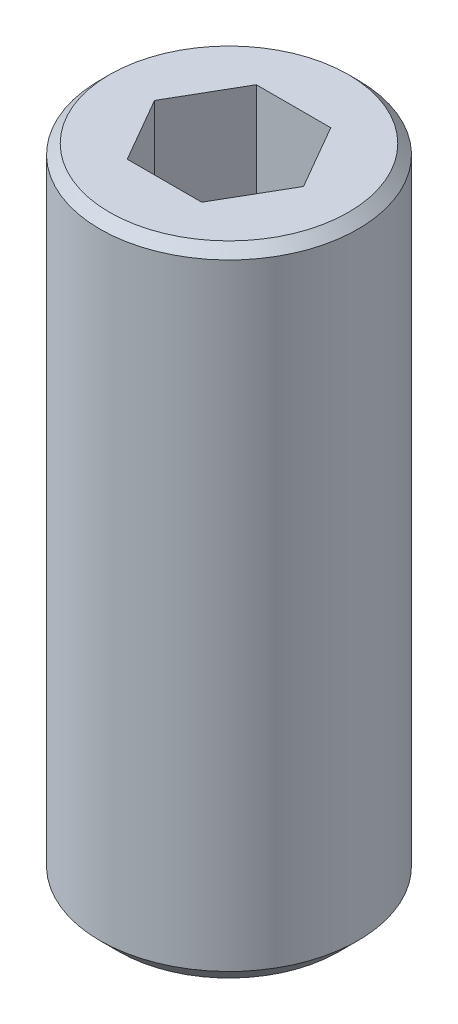
ISO-10303-21;
HEADER;
FILE_DESCRIPTION(('STEP AP214'),'2;1');
FILE_NAME('part.step','',(''),(''),'','','');
FILE_SCHEMA(('AUTOMOTIVE_DESIGN { 1 0 10303 214 1 1 1 1 }'));
ENDSEC;
DATA;
#1=APPLICATION_CONTEXT('core data for automotive mechanical design processes');
#2=APPLICATION_PROTOCOL_DEFINITION('international standard','automotive_design',2000,#1);
#3=PRODUCT_CONTEXT('',#1,'mechanical');
#4=PRODUCT('Part','Part','',(#3));
#5=PRODUCT_RELATED_PRODUCT_CATEGORY('part','',(#4));
#6=PRODUCT_DEFINITION_FORMATION('','',#4);
#7=PRODUCT_DEFINITION_CONTEXT('part definition',#1,'design');
#8=PRODUCT_DEFINITION('design','',#6,#7);
#9=PRODUCT_DEFINITION_SHAPE('','',#8);
#10=(LENGTH_UNIT() NAMED_UNIT(*) SI_UNIT(.MILLI.,.METRE.));
#11=(NAMED_UNIT(*) PLANE_ANGLE_UNIT() SI_UNIT($,.RADIAN.));
#12=(NAMED_UNIT(*) SI_UNIT($,.STERADIAN.) SOLID_ANGLE_UNIT());
#13=UNCERTAINTY_MEASURE_WITH_UNIT(LENGTH_MEASURE(1.E-05),#10,'distance_accuracy_value','');
#14=(GEOMETRIC_REPRESENTATION_CONTEXT(3) GLOBAL_UNCERTAINTY_ASSIGNED_CONTEXT((#13)) GLOBAL_UNIT_ASSIGNED_CONTEXT((#10,
#11,#12)) REPRESENTATION_CONTEXT('',''));
#15=CARTESIAN_POINT('',(0.,0.,0.));
#16=DIRECTION('',(0.,0.,1.));
#17=DIRECTION('',(1.,0.,0.));
#18=AXIS2_PLACEMENT_3D('',#15,#16,#17);
#19=CARTESIAN_POINT('',(0.,0.,0.));
#20=DIRECTION('',(0.,-1.,0.));
#21=DIRECTION('',(0.,0.,-1.));
#22=AXIS2_PLACEMENT_3D('',#19,#20,#21);
#23=PLANE('',#22);
#24=CARTESIAN_POINT('',(0.,0.,0.));
#25=DIRECTION('',(0.,-1.,0.));
#26=DIRECTION('',(0.,0.,-1.));
#27=AXIS2_PLACEMENT_3D('',#24,#25,#26);
#28=CIRCLE('',#27,1.85);
#29=CARTESIAN_POINT('',(0.,0.,-1.85));
#30=VERTEX_POINT('',#29);
#31=EDGE_CURVE('E44',#30,#30,#28,.F.);
#32=ORIENTED_EDGE('',*,*,#31,.T.);
#33=EDGE_LOOP('',(#32));
#34=FACE_BOUND('',#33,.T.);
#35=DIRECTION('',(-0.5,0.,0.866025403784439));
#36=VECTOR('',#35,1.);
#37=CARTESIAN_POINT('',(-0.577350269189626,0.,-1.));
#38=LINE('',#37,#36);
#39=CARTESIAN_POINT('',(-0.577350269189626,0.,-1.));
#40=VERTEX_POINT('',#39);
#41=CARTESIAN_POINT('',(-1.15470053837925,0.,0.));
#42=VERTEX_POINT('',#41);
#43=EDGE_CURVE('E125',#40,#42,#38,.T.);
#44=ORIENTED_EDGE('',*,*,#43,.F.);
#45=DIRECTION('',(-1.,0.,0.));
#46=VECTOR('',#45,1.);
#47=CARTESIAN_POINT('',(0.577350269189626,0.,-1.));
#48=LINE('',#47,#46);
#49=CARTESIAN_POINT('',(0.577350269189626,0.,-1.));
#50=VERTEX_POINT('',#49);
#51=EDGE_CURVE('E51',#50,#40,#48,.T.);
#52=ORIENTED_EDGE('',*,*,#51,.F.);
#53=DIRECTION('',(-0.5,0.,-0.866025403784438));
#54=VECTOR('',#53,1.);
#55=CARTESIAN_POINT('',(1.15470053837925,0.,0.));
#56=LINE('',#55,#54);
#57=CARTESIAN_POINT('',(1.15470053837925,0.,0.));
#58=VERTEX_POINT('',#57);
#59=EDGE_CURVE('E134',#58,#50,#56,.T.);
#60=ORIENTED_EDGE('',*,*,#59,.F.);
#61=DIRECTION('',(0.5,0.,-0.866025403784439));
#62=VECTOR('',#61,1.);
#63=CARTESIAN_POINT('',(0.577350269189626,0.,1.));
#64=LINE('',#63,#62);
#65=CARTESIAN_POINT('',(0.577350269189626,0.,1.));
#66=VERTEX_POINT('',#65);
#67=EDGE_CURVE('E132',#66,#58,#64,.T.);
#68=ORIENTED_EDGE('',*,*,#67,.F.);
#69=DIRECTION('',(1.,0.,0.));
#70=VECTOR('',#69,1.);
#71=CARTESIAN_POINT('',(-0.577350269189626,0.,1.));
#72=LINE('',#71,#70);
#73=CARTESIAN_POINT('',(-0.577350269189626,0.,1.));
#74=VERTEX_POINT('',#73);
#75=EDGE_CURVE('E99',#74,#66,#72,.T.);
#76=ORIENTED_EDGE('',*,*,#75,.F.);
#77=DIRECTION('',(0.5,0.,0.866025403784439));
#78=VECTOR('',#77,1.);
#79=CARTESIAN_POINT('',(-1.15470053837925,0.,0.));
#80=LINE('',#79,#78);
#81=EDGE_CURVE('E128',#42,#74,#80,.T.);
#82=ORIENTED_EDGE('',*,*,#81,.F.);
#83=EDGE_LOOP('',(#44,#52,#60,#68,#76,#82));
#84=FACE_BOUND('',#83,.T.);
#85=ADVANCED_FACE('F36',(#34,#84),#23,.F.);
#86=CARTESIAN_POINT('',(0.,0.,0.));
#87=DIRECTION('',(0.,1.,0.));
#88=DIRECTION('',(0.,0.,1.));
#89=AXIS2_PLACEMENT_3D('',#86,#87,#88);
#90=CYLINDRICAL_SURFACE('',#89,2.);
#91=CARTESIAN_POINT('',(0.,-0.150000000000002,0.));
#92=DIRECTION('',(0.,-1.,0.));
#93=DIRECTION('',(0.,0.,-1.));
#94=AXIS2_PLACEMENT_3D('',#91,#92,#93);
#95=CIRCLE('',#94,2.);
#96=CARTESIAN_POINT('',(0.,-0.150000000000002,-2.));
#97=VERTEX_POINT('',#96);
#98=EDGE_CURVE('E11',#97,#97,#95,.T.);
#99=ORIENTED_EDGE('',*,*,#98,.T.);
#100=EDGE_LOOP('',(#99));
#101=FACE_BOUND('',#100,.T.);
#102=CARTESIAN_POINT('',(0.,-9.7,0.));
#103=DIRECTION('',(0.,1.,0.));
#104=DIRECTION('',(0.,0.,1.));
#105=AXIS2_PLACEMENT_3D('',#102,#103,#104);
#106=CIRCLE('',#105,2.);
#107=CARTESIAN_POINT('',(0.,-9.7,2.));
#108=VERTEX_POINT('',#107);
#109=EDGE_CURVE('E138',#108,#108,#106,.T.);
#110=ORIENTED_EDGE('',*,*,#109,.T.);
#111=EDGE_LOOP('',(#110));
#112=FACE_BOUND('',#111,.T.);
#113=ADVANCED_FACE('F162',(#101,#112),#90,.T.);
#114=CARTESIAN_POINT('',(2.,-10.,0.));
#115=DIRECTION('',(0.,1.,0.));
#116=DIRECTION('',(0.,0.,1.));
#117=AXIS2_PLACEMENT_3D('',#114,#115,#116);
#118=PLANE('',#117);
#119=CARTESIAN_POINT('',(0.,-10.,0.));
#120=DIRECTION('',(0.,1.,0.));
#121=DIRECTION('',(0.,0.,1.));
#122=AXIS2_PLACEMENT_3D('',#119,#120,#121);
#123=CIRCLE('',#122,1.7);
#124=CARTESIAN_POINT('',(0.,-10.,1.7));
#125=VERTEX_POINT('',#124);
#126=EDGE_CURVE('E146',#125,#125,#123,.F.);
#127=ORIENTED_EDGE('',*,*,#126,.T.);
#128=EDGE_LOOP('',(#127));
#129=FACE_BOUND('',#128,.T.);
#130=ADVANCED_FACE('F167',(#129),#118,.F.);
#131=CARTESIAN_POINT('',(0.577350269189626,-2.,-1.));
#132=DIRECTION('',(0.,0.,-1.));
#133=DIRECTION('',(-1.,0.,0.));
#134=AXIS2_PLACEMENT_3D('',#131,#132,#133);
#135=PLANE('',#134);
#136=ORIENTED_EDGE('',*,*,#51,.T.);
#137=DIRECTION('',(0.,1.,0.));
#138=VECTOR('',#137,1.);
#139=CARTESIAN_POINT('',(-0.577350269189626,-2.,-1.));
#140=LINE('',#139,#138);
#141=CARTESIAN_POINT('',(-0.577350269189626,-2.,-1.));
#142=VERTEX_POINT('',#141);
#143=EDGE_CURVE('E81',#142,#40,#140,.T.);
#144=ORIENTED_EDGE('',*,*,#143,.F.);
#145=DIRECTION('',(-1.,0.,0.));
#146=VECTOR('',#145,1.);
#147=CARTESIAN_POINT('',(0.577350269189626,-2.,-1.));
#148=LINE('',#147,#146);
#149=CARTESIAN_POINT('',(0.577350269189626,-2.,-1.));
#150=VERTEX_POINT('',#149);
#151=EDGE_CURVE('E136',#150,#142,#148,.T.);
#152=ORIENTED_EDGE('',*,*,#151,.F.);
#153=DIRECTION('',(0.,1.,0.));
#154=VECTOR('',#153,1.);
#155=CARTESIAN_POINT('',(0.577350269189626,-2.,-1.));
#156=LINE('',#155,#154);
#157=EDGE_CURVE('E59',#150,#50,#156,.T.);
#158=ORIENTED_EDGE('',*,*,#157,.T.);
#159=EDGE_LOOP('',(#136,#144,#152,#158));
#160=FACE_BOUND('',#159,.T.);
#161=ADVANCED_FACE('F173',(#160),#135,.F.);
#162=CARTESIAN_POINT('',(1.15470053837925,-2.,0.));
#163=DIRECTION('',(0.866025403784439,0.,-0.5));
#164=DIRECTION('',(-0.5,0.,-0.866025403784439));
#165=AXIS2_PLACEMENT_3D('',#162,#163,#164);
#166=PLANE('',#165);
#167=ORIENTED_EDGE('',*,*,#59,.T.);
#168=ORIENTED_EDGE('',*,*,#157,.F.);
#169=DIRECTION('',(-0.5,0.,-0.866025403784438));
#170=VECTOR('',#169,1.);
#171=CARTESIAN_POINT('',(1.15470053837925,-2.,0.));
#172=LINE('',#171,#170);
#173=CARTESIAN_POINT('',(1.15470053837925,-2.,0.));
#174=VERTEX_POINT('',#173);
#175=EDGE_CURVE('E111',#174,#150,#172,.T.);
#176=ORIENTED_EDGE('',*,*,#175,.F.);
#177=DIRECTION('',(0.,1.,0.));
#178=VECTOR('',#177,1.);
#179=CARTESIAN_POINT('',(1.15470053837925,-2.,0.));
#180=LINE('',#179,#178);
#181=EDGE_CURVE('E103',#174,#58,#180,.T.);
#182=ORIENTED_EDGE('',*,*,#181,.T.);
#183=EDGE_LOOP('',(#167,#168,#176,#182));
#184=FACE_BOUND('',#183,.T.);
#185=ADVANCED_FACE('F177',(#184),#166,.F.);
#186=CARTESIAN_POINT('',(0.577350269189626,-2.,1.));
#187=DIRECTION('',(0.866025403784439,0.,0.5));
#188=DIRECTION('',(0.5,0.,-0.866025403784439));
#189=AXIS2_PLACEMENT_3D('',#186,#187,#188);
#190=PLANE('',#189);
#191=ORIENTED_EDGE('',*,*,#67,.T.);
#192=ORIENTED_EDGE('',*,*,#181,.F.);
#193=DIRECTION('',(0.5,0.,-0.866025403784439));
#194=VECTOR('',#193,1.);
#195=CARTESIAN_POINT('',(0.577350269189626,-2.,1.));
#196=LINE('',#195,#194);
#197=CARTESIAN_POINT('',(0.577350269189626,-2.,1.));
#198=VERTEX_POINT('',#197);
#199=EDGE_CURVE('E107',#198,#174,#196,.T.);
#200=ORIENTED_EDGE('',*,*,#199,.F.);
#201=DIRECTION('',(0.,1.,0.));
#202=VECTOR('',#201,1.);
#203=CARTESIAN_POINT('',(0.577350269189626,-2.,1.));
#204=LINE('',#203,#202);
#205=EDGE_CURVE('E92',#198,#66,#204,.T.);
#206=ORIENTED_EDGE('',*,*,#205,.T.);
#207=EDGE_LOOP('',(#191,#192,#200,#206));
#208=FACE_BOUND('',#207,.T.);
#209=ADVANCED_FACE('F108',(#208),#190,.F.);
#210=CARTESIAN_POINT('',(-0.577350269189626,-2.,1.));
#211=DIRECTION('',(0.,0.,1.));
#212=DIRECTION('',(1.,0.,0.));
#213=AXIS2_PLACEMENT_3D('',#210,#211,#212);
#214=PLANE('',#213);
#215=ORIENTED_EDGE('',*,*,#75,.T.);
#216=ORIENTED_EDGE('',*,*,#205,.F.);
#217=DIRECTION('',(1.,0.,0.));
#218=VECTOR('',#217,1.);
#219=CARTESIAN_POINT('',(-0.577350269189626,-2.,1.));
#220=LINE('',#219,#218);
#221=CARTESIAN_POINT('',(-0.577350269189626,-2.,1.));
#222=VERTEX_POINT('',#221);
#223=EDGE_CURVE('E96',#222,#198,#220,.T.);
#224=ORIENTED_EDGE('',*,*,#223,.F.);
#225=DIRECTION('',(0.,1.,0.));
#226=VECTOR('',#225,1.);
#227=CARTESIAN_POINT('',(-0.577350269189626,-2.,1.));
#228=LINE('',#227,#226);
#229=EDGE_CURVE('E104',#222,#74,#228,.T.);
#230=ORIENTED_EDGE('',*,*,#229,.T.);
#231=EDGE_LOOP('',(#215,#216,#224,#230));
#232=FACE_BOUND('',#231,.T.);
#233=ADVANCED_FACE('F94',(#232),#214,.F.);
#234=CARTESIAN_POINT('',(-1.15470053837925,-2.,0.));
#235=DIRECTION('',(-0.866025403784439,0.,0.5));
#236=DIRECTION('',(0.5,0.,0.866025403784439));
#237=AXIS2_PLACEMENT_3D('',#234,#235,#236);
#238=PLANE('',#237);
#239=ORIENTED_EDGE('',*,*,#81,.T.);
#240=ORIENTED_EDGE('',*,*,#229,.F.);
#241=DIRECTION('',(0.5,0.,0.866025403784439));
#242=VECTOR('',#241,1.);
#243=CARTESIAN_POINT('',(-1.15470053837925,-2.,0.));
#244=LINE('',#243,#242);
#245=CARTESIAN_POINT('',(-1.15470053837925,-2.,0.));
#246=VERTEX_POINT('',#245);
#247=EDGE_CURVE('E117',#246,#222,#244,.T.);
#248=ORIENTED_EDGE('',*,*,#247,.F.);
#249=DIRECTION('',(0.,1.,0.));
#250=VECTOR('',#249,1.);
#251=CARTESIAN_POINT('',(-1.15470053837925,-2.,0.));
#252=LINE('',#251,#250);
#253=EDGE_CURVE('E141',#246,#42,#252,.T.);
#254=ORIENTED_EDGE('',*,*,#253,.T.);
#255=EDGE_LOOP('',(#239,#240,#248,#254));
#256=FACE_BOUND('',#255,.T.);
#257=ADVANCED_FACE('F181',(#256),#238,.F.);
#258=CARTESIAN_POINT('',(-0.577350269189626,-2.,-1.));
#259=DIRECTION('',(-0.866025403784439,0.,-0.5));
#260=DIRECTION('',(-0.5,0.,0.866025403784439));
#261=AXIS2_PLACEMENT_3D('',#258,#259,#260);
#262=PLANE('',#261);
#263=ORIENTED_EDGE('',*,*,#43,.T.);
#264=ORIENTED_EDGE('',*,*,#253,.F.);
#265=DIRECTION('',(-0.5,0.,0.866025403784439));
#266=VECTOR('',#265,1.);
#267=CARTESIAN_POINT('',(-0.577350269189626,-2.,-1.));
#268=LINE('',#267,#266);
#269=EDGE_CURVE('E119',#142,#246,#268,.T.);
#270=ORIENTED_EDGE('',*,*,#269,.F.);
#271=ORIENTED_EDGE('',*,*,#143,.T.);
#272=EDGE_LOOP('',(#263,#264,#270,#271));
#273=FACE_BOUND('',#272,.T.);
#274=ADVANCED_FACE('F178',(#273),#262,.F.);
#275=CARTESIAN_POINT('',(-0.577350269189626,-2.,-1.));
#276=DIRECTION('',(0.,1.,0.));
#277=DIRECTION('',(0.,0.,1.));
#278=AXIS2_PLACEMENT_3D('',#275,#276,#277);
#279=PLANE('',#278);
#280=ORIENTED_EDGE('',*,*,#151,.T.);
#281=ORIENTED_EDGE('',*,*,#269,.T.);
#282=ORIENTED_EDGE('',*,*,#247,.T.);
#283=ORIENTED_EDGE('',*,*,#223,.T.);
#284=ORIENTED_EDGE('',*,*,#199,.T.);
#285=ORIENTED_EDGE('',*,*,#175,.T.);
#286=EDGE_LOOP('',(#280,#281,#282,#283,#284,#285));
#287=FACE_BOUND('',#286,.T.);
#288=ADVANCED_FACE('F114',(#287),#279,.T.);
#289=CARTESIAN_POINT('',(0.,-9.7,0.));
#290=DIRECTION('',(0.,1.,0.));
#291=DIRECTION('',(0.,0.,1.));
#292=AXIS2_PLACEMENT_3D('',#289,#290,#291);
#293=CONICAL_SURFACE('',#292,2.,0.785398163397453);
#294=ORIENTED_EDGE('',*,*,#126,.F.);
#295=EDGE_LOOP('',(#294));
#296=FACE_BOUND('',#295,.T.);
#297=ORIENTED_EDGE('',*,*,#109,.F.);
#298=EDGE_LOOP('',(#297));
#299=FACE_BOUND('',#298,.T.);
#300=ADVANCED_FACE('F154',(#296,#299),#293,.T.);
#301=CARTESIAN_POINT('',(0.,0.,0.));
#302=DIRECTION('',(0.,-1.,0.));
#303=DIRECTION('',(0.,0.,-1.));
#304=AXIS2_PLACEMENT_3D('',#301,#302,#303);
#305=CONICAL_SURFACE('',#304,1.85,0.785398163397451);
#306=ORIENTED_EDGE('',*,*,#98,.F.);
#307=EDGE_LOOP('',(#306));
#308=FACE_BOUND('',#307,.T.);
#309=ORIENTED_EDGE('',*,*,#31,.F.);
#310=EDGE_LOOP('',(#309));
#311=FACE_BOUND('',#310,.T.);
#312=ADVANCED_FACE('F38',(#308,#311),#305,.T.);
#313=CLOSED_SHELL('',(#85,#113,#130,#161,#185,#209,#233,#257,#274,#288,#300,#312));
#314=MANIFOLD_SOLID_BREP('B2',#313);
#315=ADVANCED_BREP_SHAPE_REPRESENTATION('',(#18,#314),#14);
#316=SHAPE_DEFINITION_REPRESENTATION(#9,#315);
ENDSEC;
END-ISO-10303-21;
